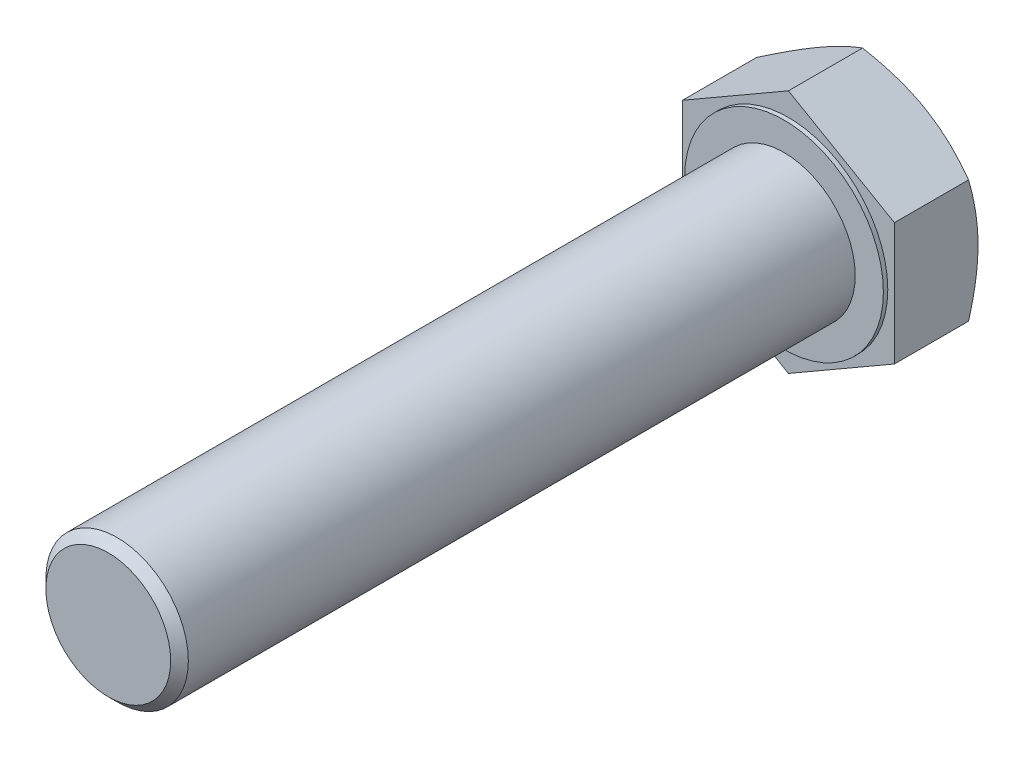
ISO-10303-21;
HEADER;
FILE_DESCRIPTION(('STEP AP214'),'2;1');
FILE_NAME('part.step','',(''),(''),'','','');
FILE_SCHEMA(('AUTOMOTIVE_DESIGN { 1 0 10303 214 1 1 1 1 }'));
ENDSEC;
DATA;
#1=APPLICATION_CONTEXT('core data for automotive mechanical design processes');
#2=APPLICATION_PROTOCOL_DEFINITION('international standard','automotive_design',2000,#1);
#3=PRODUCT_CONTEXT('',#1,'mechanical');
#4=PRODUCT('Part','Part','',(#3));
#5=PRODUCT_RELATED_PRODUCT_CATEGORY('part','',(#4));
#6=PRODUCT_DEFINITION_FORMATION('','',#4);
#7=PRODUCT_DEFINITION_CONTEXT('part definition',#1,'design');
#8=PRODUCT_DEFINITION('design','',#6,#7);
#9=PRODUCT_DEFINITION_SHAPE('','',#8);
#10=(LENGTH_UNIT() NAMED_UNIT(*) SI_UNIT(.MILLI.,.METRE.));
#11=(NAMED_UNIT(*) PLANE_ANGLE_UNIT() SI_UNIT($,.RADIAN.));
#12=(NAMED_UNIT(*) SI_UNIT($,.STERADIAN.) SOLID_ANGLE_UNIT());
#13=UNCERTAINTY_MEASURE_WITH_UNIT(LENGTH_MEASURE(1.E-05),#10,'distance_accuracy_value','');
#14=(GEOMETRIC_REPRESENTATION_CONTEXT(3) GLOBAL_UNCERTAINTY_ASSIGNED_CONTEXT((#13)) GLOBAL_UNIT_ASSIGNED_CONTEXT((#10,
#11,#12)) REPRESENTATION_CONTEXT('',''));
#15=CARTESIAN_POINT('',(0.,0.,0.));
#16=DIRECTION('',(0.,0.,1.));
#17=DIRECTION('',(1.,0.,0.));
#18=AXIS2_PLACEMENT_3D('',#15,#16,#17);
#19=CARTESIAN_POINT('',(12.,6.92820323027551,10.));
#20=DIRECTION('',(-0.5,-0.866025403784439,0.));
#21=DIRECTION('',(0.866025403784439,-0.5,0.));
#22=AXIS2_PLACEMENT_3D('',#19,#20,#21);
#23=PLANE('',#22);
#24=CARTESIAN_POINT('',(-0.00019999999999952,13.8565219306049,1.60973499169925));
#25=CARTESIAN_POINT('',(0.263585795242261,13.7042251307133,1.52182118666063));
#26=CARTESIAN_POINT('',(0.528355119381798,13.5513604901482,1.43789755203143));
#27=CARTESIAN_POINT('',(1.06001701652966,13.244405350712,1.27913777334761));
#28=CARTESIAN_POINT('',(1.32691025729307,13.0903144663124,1.20430461814835));
#29=CARTESIAN_POINT('',(2.13189040597901,12.6255589607763,0.994889094328923));
#30=CARTESIAN_POINT('',(2.6731550738251,12.3130596590925,0.875774791197622));
#31=CARTESIAN_POINT('',(3.48313282915499,11.8454187840152,0.736102615477916));
#32=CARTESIAN_POINT('',(3.74942610048137,11.6916742921315,0.696315351515216));
#33=CARTESIAN_POINT('',(4.28324559869684,11.3834734611381,0.629594923691863));
#34=CARTESIAN_POINT('',(4.55077184921738,11.2290171083848,0.602662007242549));
#35=CARTESIAN_POINT('',(5.08627036632535,10.9198468953819,0.562340146391698));
#36=CARTESIAN_POINT('',(5.35424172206872,10.7651335610083,0.548935107357087));
#37=CARTESIAN_POINT('',(5.89043273227404,10.4555635369292,0.535954648231942));
#38=CARTESIAN_POINT('',(6.15865237880804,10.3007068518009,0.536378800837519));
#39=CARTESIAN_POINT('',(6.6600893787841,10.0112020648831,0.550091573817556));
#40=CARTESIAN_POINT('',(6.89334249317775,9.87653331649856,0.561707537053307));
#41=CARTESIAN_POINT('',(7.35931224173077,9.60750555673725,0.595179563347148));
#42=CARTESIAN_POINT('',(7.59202883677177,9.47314656794544,0.61703635074099));
#43=CARTESIAN_POINT('',(8.05679907604294,9.2048113451909,0.670608971017683));
#44=CARTESIAN_POINT('',(8.288852012362,9.07083551994085,0.702332946967696));
#45=CARTESIAN_POINT('',(8.75186996730498,8.80351197901489,0.775083330145212));
#46=CARTESIAN_POINT('',(8.98283491089354,8.67016430666067,0.816110369657969));
#47=CARTESIAN_POINT('',(9.68394195876366,8.26537996384211,0.954183207756574));
#48=CARTESIAN_POINT('',(10.1520537462785,7.99511549730956,1.06499644281409));
#49=CARTESIAN_POINT('',(11.0812971075914,7.45861659251289,1.31649732141265));
#50=CARTESIAN_POINT('',(11.5424405792922,7.19237528499144,1.45712589713415));
#51=CARTESIAN_POINT('',(12.0002,6.92808776022168,1.60973499169925));
#52=B_SPLINE_CURVE_WITH_KNOTS('',3,(#24,#25,#26,#27,#28,#29,#30,#31,#32,#33,#34,#35,#36,#37,#38,
#39,#40,#41,#42,#43,#44,#45,#46,#47,#48,#49,#50,#51),.UNSPECIFIED.,.F.,.F.,(4,2,2,2,2,2,2,2,2,2,
2,2,2,4),(0.,0.951004872251247,1.90232158356438,3.80900466161368,4.7389455141357,
5.66890426477609,6.59775529889865,7.5265776327693,8.33514643820578,9.14377244252749,
9.95306755799765,10.7624176939264,12.4167102786892,14.0677556316691),.UNSPECIFIED.);
#53=CARTESIAN_POINT('',(0.,13.856406460551,1.60966832419923));
#54=VERTEX_POINT('',#53);
#55=CARTESIAN_POINT('',(12.,6.92820323027552,1.60966832419923));
#56=VERTEX_POINT('',#55);
#57=EDGE_CURVE('E53',#54,#56,#52,.T.);
#58=ORIENTED_EDGE('',*,*,#57,.F.);
#59=DIRECTION('',(0.,0.,-1.));
#60=VECTOR('',#59,1.);
#61=CARTESIAN_POINT('',(0.,13.856406460551,10.));
#62=LINE('',#61,#60);
#63=CARTESIAN_POINT('',(0.,13.856406460551,10.));
#64=VERTEX_POINT('',#63);
#65=EDGE_CURVE('E122',#64,#54,#62,.T.);
#66=ORIENTED_EDGE('',*,*,#65,.F.);
#67=DIRECTION('',(-0.866025403784439,0.5,0.));
#68=VECTOR('',#67,1.);
#69=CARTESIAN_POINT('',(12.,6.92820323027551,10.));
#70=LINE('',#69,#68);
#71=CARTESIAN_POINT('',(12.,6.92820323027551,10.));
#72=VERTEX_POINT('',#71);
#73=EDGE_CURVE('E163',#72,#64,#70,.T.);
#74=ORIENTED_EDGE('',*,*,#73,.F.);
#75=DIRECTION('',(0.,0.,-1.));
#76=VECTOR('',#75,1.);
#77=CARTESIAN_POINT('',(12.,6.92820323027551,10.));
#78=LINE('',#77,#76);
#79=EDGE_CURVE('E110',#72,#56,#78,.T.);
#80=ORIENTED_EDGE('',*,*,#79,.T.);
#81=EDGE_LOOP('',(#58,#66,#74,#80));
#82=FACE_BOUND('',#81,.T.);
#83=ADVANCED_FACE('F38',(#82),#23,.F.);
#84=CARTESIAN_POINT('',(0.,13.856406460551,10.));
#85=DIRECTION('',(0.5,-0.866025403784439,0.));
#86=DIRECTION('',(0.866025403784439,0.5,0.));
#87=AXIS2_PLACEMENT_3D('',#84,#85,#86);
#88=PLANE('',#87);
#89=CARTESIAN_POINT('',(-12.0002,6.92808776022168,1.60973499169925));
#90=CARTESIAN_POINT('',(-11.7364142047577,7.08038456011319,1.52182118666063));
#91=CARTESIAN_POINT('',(-11.4716448806182,7.23324920067831,1.43789755203143));
#92=CARTESIAN_POINT('',(-10.9399829834703,7.5402043401145,1.27913777334761));
#93=CARTESIAN_POINT('',(-10.6730897427069,7.69429522451414,1.20430461814835));
#94=CARTESIAN_POINT('',(-9.86810959402099,8.15905073005028,0.994889094328923));
#95=CARTESIAN_POINT('',(-9.3268449261749,8.47155003173405,0.875774791197622));
#96=CARTESIAN_POINT('',(-8.51686717084501,8.93919090681137,0.736102615477916));
#97=CARTESIAN_POINT('',(-8.25057389951863,9.09293539869504,0.696315351515216));
#98=CARTESIAN_POINT('',(-7.71675440130316,9.40113622968841,0.629594923691863));
#99=CARTESIAN_POINT('',(-7.44922815078262,9.55559258244174,0.602662007242549));
#100=CARTESIAN_POINT('',(-6.91372963367465,9.86476279544467,0.562340146391698));
#101=CARTESIAN_POINT('',(-6.64575827793128,10.0194761298182,0.548935107357088));
#102=CARTESIAN_POINT('',(-6.10956726772596,10.3290461538973,0.535954648231943));
#103=CARTESIAN_POINT('',(-5.84134762119197,10.4839028390257,0.536378800837518));
#104=CARTESIAN_POINT('',(-5.3399106212159,10.7734076259435,0.550091573817556));
#105=CARTESIAN_POINT('',(-5.10665750682225,10.908076374328,0.561707537053307));
#106=CARTESIAN_POINT('',(-4.64068775826924,11.1771041340893,0.59517956334715));
#107=CARTESIAN_POINT('',(-4.40797116322823,11.3114631228811,0.617036350740993));
#108=CARTESIAN_POINT('',(-3.94320092395706,11.5797983456356,0.670608971017685));
#109=CARTESIAN_POINT('',(-3.711147987638,11.7137741708857,0.702332946967698));
#110=CARTESIAN_POINT('',(-3.24813003269502,11.9810977118116,0.775083330145214));
#111=CARTESIAN_POINT('',(-3.01716508910646,12.1144453841659,0.816110369657972));
#112=CARTESIAN_POINT('',(-2.31605804123633,12.5192297269844,0.954183207756577));
#113=CARTESIAN_POINT('',(-1.84794625372147,12.789494193517,1.0649964428141));
#114=CARTESIAN_POINT('',(-0.918702892408578,13.3259930983136,1.31649732141265));
#115=CARTESIAN_POINT('',(-0.457559420707845,13.5922344058351,1.45712589713415));
#116=CARTESIAN_POINT('',(0.000199999999997867,13.8565219306049,1.60973499169925));
#117=B_SPLINE_CURVE_WITH_KNOTS('',3,(#89,#90,#91,#92,#93,#94,#95,#96,#97,#98,#99,#100,#101,#102,
#103,#104,#105,#106,#107,#108,#109,#110,#111,#112,#113,#114,#115,#116),.UNSPECIFIED.,.F.,.F.,(4,
2,2,2,2,2,2,2,2,2,2,2,2,4),(0.,0.951004872251245,1.90232158356438,3.80900466161368,
4.7389455141357,5.66890426477609,6.59775529889865,7.5265776327693,8.33514643820578,
9.14377244252749,9.95306755799765,10.7624176939264,12.4167102786892,14.0677556316691),.UNSPECIFIED.);
#118=CARTESIAN_POINT('',(-12.,6.92820323027551,1.60966832419923));
#119=VERTEX_POINT('',#118);
#120=EDGE_CURVE('E164',#119,#54,#117,.T.);
#121=ORIENTED_EDGE('',*,*,#120,.F.);
#122=DIRECTION('',(0.,0.,-1.));
#123=VECTOR('',#122,1.);
#124=CARTESIAN_POINT('',(-12.,6.92820323027551,10.));
#125=LINE('',#124,#123);
#126=CARTESIAN_POINT('',(-12.,6.92820323027551,10.));
#127=VERTEX_POINT('',#126);
#128=EDGE_CURVE('E119',#127,#119,#125,.T.);
#129=ORIENTED_EDGE('',*,*,#128,.F.);
#130=DIRECTION('',(-0.866025403784439,-0.5,0.));
#131=VECTOR('',#130,1.);
#132=CARTESIAN_POINT('',(0.,13.856406460551,10.));
#133=LINE('',#132,#131);
#134=EDGE_CURVE('E226',#64,#127,#133,.T.);
#135=ORIENTED_EDGE('',*,*,#134,.F.);
#136=ORIENTED_EDGE('',*,*,#65,.T.);
#137=EDGE_LOOP('',(#121,#129,#135,#136));
#138=FACE_BOUND('',#137,.T.);
#139=ADVANCED_FACE('F145',(#138),#88,.F.);
#140=CARTESIAN_POINT('',(-12.,6.92820323027551,10.));
#141=DIRECTION('',(1.,0.,0.));
#142=DIRECTION('',(0.,0.,-1.));
#143=AXIS2_PLACEMENT_3D('',#140,#141,#142);
#144=PLANE('',#143);
#145=CARTESIAN_POINT('',(-12.,-18.5622395178518,6.37102582667648));
#146=CARTESIAN_POINT('',(-12.,-18.3003803929698,6.24406455119856));
#147=CARTESIAN_POINT('',(-12.,-18.0382126831571,6.11774003928089));
#148=CARTESIAN_POINT('',(-12.,-17.5131956762022,5.86650885967292));
#149=CARTESIAN_POINT('',(-12.,-17.2503463721615,5.74160220640276));
#150=CARTESIAN_POINT('',(-12.,-16.4606087734957,5.369192275619));
#151=CARTESIAN_POINT('',(-12.,-15.9326090076651,5.12403705450678));
#152=CARTESIAN_POINT('',(-12.,-14.8701637187487,4.64014973783935));
#153=CARTESIAN_POINT('',(-12.,-14.3356987223154,4.40146029573394));
#154=CARTESIAN_POINT('',(-12.,-13.262501360647,3.93391013278404));
#155=CARTESIAN_POINT('',(-12.,-12.7237691999453,3.70504894418877));
#156=CARTESIAN_POINT('',(-12.,-11.6240116959047,3.25269596667985));
#157=CARTESIAN_POINT('',(-12.,-11.0628209387991,3.02960422316616));
#158=CARTESIAN_POINT('',(-12.,-9.93385235573537,2.60042034846911));
#159=CARTESIAN_POINT('',(-12.,-9.36607379617379,2.39433013167061));
#160=CARTESIAN_POINT('',(-12.,-8.22412305865071,2.00459736039153));
#161=CARTESIAN_POINT('',(-12.,-7.64996665564808,1.82090895759682));
#162=CARTESIAN_POINT('',(-12.,-6.49336377275,1.48189534563762));
#163=CARTESIAN_POINT('',(-12.,-5.91091998179839,1.32656115305126));
#164=CARTESIAN_POINT('',(-12.,-5.0325394312787,1.12089109549254));
#165=CARTESIAN_POINT('',(-12.,-4.73975126819011,1.05702458193855));
#166=CARTESIAN_POINT('',(-12.,-4.15218334683762,0.93916898527813));
#167=CARTESIAN_POINT('',(-12.,-3.85740363024689,0.88517969615097));
#168=CARTESIAN_POINT('',(-12.,-3.26605921980418,0.7880344347601));
#169=CARTESIAN_POINT('',(-12.,-2.96949454809793,0.744878328372926));
#170=CARTESIAN_POINT('',(-12.,-2.37489861794567,0.670262140305099));
#171=CARTESIAN_POINT('',(-12.,-2.07686741619563,0.638801610018248));
#172=CARTESIAN_POINT('',(-12.,-1.48362607672732,0.588593420334001));
#173=CARTESIAN_POINT('',(-12.,-1.18842954035524,0.56968603301083));
#174=CARTESIAN_POINT('',(-12.,-0.597502220693633,0.544368463727201));
#175=CARTESIAN_POINT('',(-12.,-0.301771446283143,0.53795807594489));
#176=CARTESIAN_POINT('',(-12.,0.28969773485913,0.537786786401381));
#177=CARTESIAN_POINT('',(-12.,0.585436141632503,0.544025983519261));
#178=CARTESIAN_POINT('',(-12.,1.17638825973789,0.569002581436694));
#179=CARTESIAN_POINT('',(-12.,1.47160194589474,0.587740566497652));
#180=CARTESIAN_POINT('',(-12.,2.18251168144004,0.647518002912879));
#181=CARTESIAN_POINT('',(-12.,2.5977112358958,0.694566364353147));
#182=CARTESIAN_POINT('',(-12.,3.42500006684955,0.810813022582559));
#183=CARTESIAN_POINT('',(-12.,3.83708890703843,0.880014369563179));
#184=CARTESIAN_POINT('',(-12.,4.65777211624225,1.03810526228645));
#185=CARTESIAN_POINT('',(-12.,5.06636348387438,1.12701024087057));
#186=CARTESIAN_POINT('',(-12.,5.87943373301297,1.32179867585375));
#187=CARTESIAN_POINT('',(-12.,6.28391267958261,1.42768186319236));
#188=CARTESIAN_POINT('',(-12.,7.09769120971281,1.65636678584991));
#189=CARTESIAN_POINT('',(-12.,7.50689957155992,1.77949089984696));
#190=CARTESIAN_POINT('',(-12.,8.32128421768718,2.03835373435357));
#191=CARTESIAN_POINT('',(-12.,8.72646047518976,2.17409253857664));
#192=CARTESIAN_POINT('',(-12.,9.53298375788384,2.45603868787228));
#193=CARTESIAN_POINT('',(-12.,9.93433202651961,2.60224249257521));
#194=CARTESIAN_POINT('',(-12.,10.7337091463723,2.90340894693108));
#195=CARTESIAN_POINT('',(-12.,11.1317380377889,3.05837149033315));
#196=CARTESIAN_POINT('',(-12.,12.0768987673954,3.43641303388305));
#197=CARTESIAN_POINT('',(-12.,12.6226932670203,3.66283072506067));
#198=CARTESIAN_POINT('',(-12.,13.7096160785765,4.12663406656202));
#199=CARTESIAN_POINT('',(-12.,14.2507440942627,4.36402040722046));
#200=CARTESIAN_POINT('',(-12.,15.3292148652383,4.84754192857941));
#201=CARTESIAN_POINT('',(-12.,15.8665567294937,5.09367909138523));
#202=CARTESIAN_POINT('',(-12.,16.9379721720923,5.59291926669502));
#203=CARTESIAN_POINT('',(-12.,17.4720458217244,5.84602212659093));
#204=CARTESIAN_POINT('',(-12.,18.5380633075139,6.35816299358976));
#205=CARTESIAN_POINT('',(-12.,19.0700041290185,6.61720726474219));
#206=CARTESIAN_POINT('',(-12.,20.1315999276427,7.1399373854196));
#207=CARTESIAN_POINT('',(-12.,20.6612548946525,7.40362325544733));
#208=CARTESIAN_POINT('',(-12.,21.7185641607776,7.93479981225136));
#209=CARTESIAN_POINT('',(-12.,22.2462187141147,8.20228999352479));
#210=CARTESIAN_POINT('',(-12.,23.2998881945723,8.74048215919265));
#211=CARTESIAN_POINT('',(-12.,23.8259031153404,9.01118415601106));
#212=CARTESIAN_POINT('',(-12.,25.3127328994437,9.78117795497566));
#213=CARTESIAN_POINT('',(-12.,26.2719079428329,10.283636093319));
#214=CARTESIAN_POINT('',(-12.,28.1867351023259,11.2952882628385));
#215=CARTESIAN_POINT('',(-12.,29.1423870898137,11.8044825368766));
#216=CARTESIAN_POINT('',(-12.,31.0485410270801,12.8267409331922));
#217=CARTESIAN_POINT('',(-12.,31.9990498794206,13.3397921933275));
#218=CARTESIAN_POINT('',(-12.,33.4231550605756,14.1123595628662));
#219=CARTESIAN_POINT('',(-12.,33.8975675704071,14.3703733815282));
#220=CARTESIAN_POINT('',(-12.,34.8459028511762,14.8872978580616));
#221=CARTESIAN_POINT('',(-12.,35.3198256228506,15.1462085145814));
#222=CARTESIAN_POINT('',(-12.,35.7935313914533,15.4055157075192));
#223=B_SPLINE_CURVE_WITH_KNOTS('',3,(#145,#146,#147,#148,#149,#150,#151,#152,#153,#154,#155,
#156,#157,#158,#159,#160,#161,#162,#163,#164,#165,#166,#167,#168,#169,#170,#171,#172,#173,#174,
#175,#176,#177,#178,#179,#180,#181,#182,#183,#184,#185,#186,#187,#188,#189,#190,#191,#192,#193,
#194,#195,#196,#197,#198,#199,#200,#201,#202,#203,#204,#205,#206,#207,#208,#209,#210,#211,#212,
#213,#214,#215,#216,#217,#218,#219,#220,#221,#222),.UNSPECIFIED.,.F.,.F.,(4,2,2,2,2,2,2,2,2,2,2,
2,2,2,2,2,2,2,2,2,2,2,2,2,2,2,2,2,2,2,2,2,2,2,2,2,2,2,4),(0.,0.873041528334548,1.74609192788342,
3.49245362103937,5.24840312490627,7.00426896598962,8.81578295551501,10.6275006452678,
12.4354458667242,14.2428172816026,15.1416962785317,16.0405565243604,16.9394056410316,
17.8382202770671,18.7253671397791,19.6124993913237,20.4996385774165,21.3868192361319,
22.6396951132883,23.8927435701705,25.1467769659896,26.4007904906038,27.6825375104315,
28.9642930367858,30.2456169689066,31.5269253608236,33.2994457606477,35.072077870079,
36.8451140801501,38.6181114765059,40.3930729025591,42.1680421708859,43.9427777513983,
45.7175201992088,48.9659143522556,52.2144259424965,55.4548136932005,57.0749195316846,
58.695022929631),.UNSPECIFIED.);
#224=CARTESIAN_POINT('',(-12.,-6.92820323027551,1.60966832419929));
#225=VERTEX_POINT('',#224);
#226=EDGE_CURVE('E198',#225,#119,#223,.T.);
#227=ORIENTED_EDGE('',*,*,#226,.F.);
#228=DIRECTION('',(0.,0.,-1.));
#229=VECTOR('',#228,1.);
#230=CARTESIAN_POINT('',(-12.,-6.92820323027551,10.));
#231=LINE('',#230,#229);
#232=CARTESIAN_POINT('',(-12.,-6.92820323027551,10.));
#233=VERTEX_POINT('',#232);
#234=EDGE_CURVE('E112',#233,#225,#231,.T.);
#235=ORIENTED_EDGE('',*,*,#234,.F.);
#236=DIRECTION('',(0.,-1.,0.));
#237=VECTOR('',#236,1.);
#238=CARTESIAN_POINT('',(-12.,6.92820323027551,10.));
#239=LINE('',#238,#237);
#240=EDGE_CURVE('E230',#127,#233,#239,.T.);
#241=ORIENTED_EDGE('',*,*,#240,.F.);
#242=ORIENTED_EDGE('',*,*,#128,.T.);
#243=EDGE_LOOP('',(#227,#235,#241,#242));
#244=FACE_BOUND('',#243,.T.);
#245=ADVANCED_FACE('F150',(#244),#144,.F.);
#246=CARTESIAN_POINT('',(-12.,-6.92820323027551,10.));
#247=DIRECTION('',(0.5,0.866025403784439,0.));
#248=DIRECTION('',(-0.866025403784439,0.5,0.));
#249=AXIS2_PLACEMENT_3D('',#246,#247,#248);
#250=PLANE('',#249);
#251=CARTESIAN_POINT('',(0.000199999999997686,-13.8565219306049,1.60973499169925));
#252=CARTESIAN_POINT('',(-0.263585795242263,-13.7042251307133,1.52182118666063));
#253=CARTESIAN_POINT('',(-0.528355119381801,-13.5513604901482,1.43789755203143));
#254=CARTESIAN_POINT('',(-1.06001701652966,-13.244405350712,1.27913777334761));
#255=CARTESIAN_POINT('',(-1.32691025729307,-13.0903144663124,1.20430461814835));
#256=CARTESIAN_POINT('',(-2.13189040597901,-12.6255589607763,0.994889094328921));
#257=CARTESIAN_POINT('',(-2.6731550738251,-12.3130596590925,0.87577479119762));
#258=CARTESIAN_POINT('',(-3.483132829155,-11.8454187840152,0.736102615477914));
#259=CARTESIAN_POINT('',(-3.74942610048137,-11.6916742921315,0.696315351515214));
#260=CARTESIAN_POINT('',(-4.28324559869684,-11.3834734611381,0.629594923691861));
#261=CARTESIAN_POINT('',(-4.55077184921738,-11.2290171083848,0.602662007242547));
#262=CARTESIAN_POINT('',(-5.08627036632535,-10.9198468953819,0.562340146391696));
#263=CARTESIAN_POINT('',(-5.35424172206873,-10.7651335610083,0.548935107357086));
#264=CARTESIAN_POINT('',(-5.89043273227404,-10.4555635369292,0.535954648231943));
#265=CARTESIAN_POINT('',(-6.15865237880804,-10.3007068518009,0.536378800837519));
#266=CARTESIAN_POINT('',(-6.66008937878411,-10.011202064883,0.550091573817556));
#267=CARTESIAN_POINT('',(-6.89334249317776,-9.87653331649855,0.561707537053305));
#268=CARTESIAN_POINT('',(-7.35931224173077,-9.60750555673725,0.595179563347147));
#269=CARTESIAN_POINT('',(-7.59202883677177,-9.47314656794543,0.617036350740991));
#270=CARTESIAN_POINT('',(-8.05679907604295,-9.20481134519089,0.670608971017683));
#271=CARTESIAN_POINT('',(-8.28885201236201,-9.07083551994084,0.702332946967696));
#272=CARTESIAN_POINT('',(-8.75186996730499,-8.80351197901489,0.775083330145212));
#273=CARTESIAN_POINT('',(-8.98283491089354,-8.67016430666066,0.81611036965797));
#274=CARTESIAN_POINT('',(-9.68394195876367,-8.2653799638421,0.954183207756576));
#275=CARTESIAN_POINT('',(-10.1520537462785,-7.99511549730956,1.0649964428141));
#276=CARTESIAN_POINT('',(-11.0812971075914,-7.45861659251289,1.31649732141265));
#277=CARTESIAN_POINT('',(-11.5424405792922,-7.19237528499143,1.45712589713415));
#278=CARTESIAN_POINT('',(-12.0002,-6.92808776022167,1.60973499169925));
#279=B_SPLINE_CURVE_WITH_KNOTS('',3,(#251,#252,#253,#254,#255,#256,#257,#258,#259,#260,#261,
#262,#263,#264,#265,#266,#267,#268,#269,#270,#271,#272,#273,#274,#275,#276,#277,#278),
.UNSPECIFIED.,.F.,.F.,(4,2,2,2,2,2,2,2,2,2,2,2,2,4),(0.,0.951004872251246,1.90232158356438,
3.80900466161368,4.7389455141357,5.66890426477609,6.59775529889865,7.5265776327693,
8.33514643820579,9.14377244252749,9.95306755799766,10.7624176939264,12.4167102786892,
14.0677556316691),.UNSPECIFIED.);
#280=CARTESIAN_POINT('',(0.,-13.856406460551,1.60966832419929));
#281=VERTEX_POINT('',#280);
#282=EDGE_CURVE('E107',#281,#225,#279,.T.);
#283=ORIENTED_EDGE('',*,*,#282,.F.);
#284=DIRECTION('',(0.,0.,-1.));
#285=VECTOR('',#284,1.);
#286=CARTESIAN_POINT('',(0.,-13.856406460551,10.));
#287=LINE('',#286,#285);
#288=CARTESIAN_POINT('',(0.,-13.856406460551,10.));
#289=VERTEX_POINT('',#288);
#290=EDGE_CURVE('E106',#289,#281,#287,.T.);
#291=ORIENTED_EDGE('',*,*,#290,.F.);
#292=DIRECTION('',(0.866025403784438,-0.5,0.));
#293=VECTOR('',#292,1.);
#294=CARTESIAN_POINT('',(-12.,-6.92820323027551,10.));
#295=LINE('',#294,#293);
#296=EDGE_CURVE('E231',#233,#289,#295,.T.);
#297=ORIENTED_EDGE('',*,*,#296,.F.);
#298=ORIENTED_EDGE('',*,*,#234,.T.);
#299=EDGE_LOOP('',(#283,#291,#297,#298));
#300=FACE_BOUND('',#299,.T.);
#301=ADVANCED_FACE('F204',(#300),#250,.F.);
#302=CARTESIAN_POINT('',(0.,-13.856406460551,10.));
#303=DIRECTION('',(-0.5,0.866025403784439,0.));
#304=DIRECTION('',(-0.866025403784439,-0.5,0.));
#305=AXIS2_PLACEMENT_3D('',#302,#303,#304);
#306=PLANE('',#305);
#307=CARTESIAN_POINT('',(12.0002,-6.92808776022167,1.60973499169925));
#308=CARTESIAN_POINT('',(11.7364142047577,-7.08038456011319,1.52182118666063));
#309=CARTESIAN_POINT('',(11.4716448806182,-7.23324920067831,1.43789755203143));
#310=CARTESIAN_POINT('',(10.9399829834703,-7.5402043401145,1.2791377733476));
#311=CARTESIAN_POINT('',(10.6730897427069,-7.69429522451414,1.20430461814835));
#312=CARTESIAN_POINT('',(9.86810959402099,-8.15905073005027,0.99488909432892));
#313=CARTESIAN_POINT('',(9.3268449261749,-8.47155003173405,0.875774791197619));
#314=CARTESIAN_POINT('',(8.516867170845,-8.93919090681137,0.736102615477914));
#315=CARTESIAN_POINT('',(8.25057389951863,-9.09293539869504,0.696315351515214));
#316=CARTESIAN_POINT('',(7.71675440130316,-9.40113622968841,0.629594923691862));
#317=CARTESIAN_POINT('',(7.44922815078262,-9.55559258244173,0.602662007242547));
#318=CARTESIAN_POINT('',(6.91372963367465,-9.86476279544467,0.562340146391695));
#319=CARTESIAN_POINT('',(6.64575827793127,-10.0194761298182,0.548935107357085));
#320=CARTESIAN_POINT('',(6.10956726772596,-10.3290461538973,0.535954648231941));
#321=CARTESIAN_POINT('',(5.84134762119196,-10.4839028390257,0.536378800837519));
#322=CARTESIAN_POINT('',(5.33991062121589,-10.7734076259435,0.550091573817556));
#323=CARTESIAN_POINT('',(5.10665750682224,-10.908076374328,0.561707537053306));
#324=CARTESIAN_POINT('',(4.64068775826923,-11.1771041340893,0.595179563347147));
#325=CARTESIAN_POINT('',(4.40797116322823,-11.3114631228811,0.61703635074099));
#326=CARTESIAN_POINT('',(3.94320092395705,-11.5797983456356,0.670608971017682));
#327=CARTESIAN_POINT('',(3.71114798763799,-11.7137741708857,0.702332946967695));
#328=CARTESIAN_POINT('',(3.24813003269502,-11.9810977118116,0.775083330145211));
#329=CARTESIAN_POINT('',(3.01716508910646,-12.1144453841659,0.816110369657968));
#330=CARTESIAN_POINT('',(2.31605804123633,-12.5192297269844,0.954183207756574));
#331=CARTESIAN_POINT('',(1.84794625372147,-12.789494193517,1.06499644281409));
#332=CARTESIAN_POINT('',(0.918702892408573,-13.3259930983136,1.31649732141265));
#333=CARTESIAN_POINT('',(0.45755942070784,-13.5922344058351,1.45712589713415));
#334=CARTESIAN_POINT('',(-0.000200000000002704,-13.8565219306049,1.60973499169925));
#335=B_SPLINE_CURVE_WITH_KNOTS('',3,(#307,#308,#309,#310,#311,#312,#313,#314,#315,#316,#317,
#318,#319,#320,#321,#322,#323,#324,#325,#326,#327,#328,#329,#330,#331,#332,#333,#334),
.UNSPECIFIED.,.F.,.F.,(4,2,2,2,2,2,2,2,2,2,2,2,2,4),(0.,0.951004872251246,1.90232158356438,
3.80900466161368,4.7389455141357,5.66890426477609,6.59775529889865,7.5265776327693,
8.33514643820578,9.14377244252749,9.95306755799765,10.7624176939264,12.4167102786892,
14.0677556316691),.UNSPECIFIED.);
#336=CARTESIAN_POINT('',(12.,-6.92820323027551,1.60966832419929));
#337=VERTEX_POINT('',#336);
#338=EDGE_CURVE('E92',#337,#281,#335,.T.);
#339=ORIENTED_EDGE('',*,*,#338,.F.);
#340=DIRECTION('',(0.,0.,-1.));
#341=VECTOR('',#340,1.);
#342=CARTESIAN_POINT('',(12.,-6.92820323027551,10.));
#343=LINE('',#342,#341);
#344=CARTESIAN_POINT('',(12.,-6.92820323027551,10.));
#345=VERTEX_POINT('',#344);
#346=EDGE_CURVE('E104',#345,#337,#343,.T.);
#347=ORIENTED_EDGE('',*,*,#346,.F.);
#348=DIRECTION('',(0.866025403784439,0.5,0.));
#349=VECTOR('',#348,1.);
#350=CARTESIAN_POINT('',(0.,-13.856406460551,10.));
#351=LINE('',#350,#349);
#352=EDGE_CURVE('E235',#289,#345,#351,.T.);
#353=ORIENTED_EDGE('',*,*,#352,.F.);
#354=ORIENTED_EDGE('',*,*,#290,.T.);
#355=EDGE_LOOP('',(#339,#347,#353,#354));
#356=FACE_BOUND('',#355,.T.);
#357=ADVANCED_FACE('F102',(#356),#306,.F.);
#358=CARTESIAN_POINT('',(12.,-6.92820323027551,10.));
#359=DIRECTION('',(-1.,0.,0.));
#360=DIRECTION('',(0.,0.,1.));
#361=AXIS2_PLACEMENT_3D('',#358,#359,#360);
#362=PLANE('',#361);
#363=CARTESIAN_POINT('',(12.,-18.5622395178519,6.37102582667648));
#364=CARTESIAN_POINT('',(12.,-18.3003803929698,6.24406455119856));
#365=CARTESIAN_POINT('',(12.,-18.0382126831571,6.11774003928089));
#366=CARTESIAN_POINT('',(12.,-17.5131956762022,5.86650885967292));
#367=CARTESIAN_POINT('',(12.,-17.2503463721615,5.74160220640276));
#368=CARTESIAN_POINT('',(12.,-16.4606087734957,5.369192275619));
#369=CARTESIAN_POINT('',(12.,-15.9326090076651,5.12403705450678));
#370=CARTESIAN_POINT('',(12.,-14.8701637187487,4.64014973783935));
#371=CARTESIAN_POINT('',(12.,-14.3356987223154,4.40146029573394));
#372=CARTESIAN_POINT('',(12.,-13.262501360647,3.93391013278404));
#373=CARTESIAN_POINT('',(12.,-12.7237691999453,3.70504894418877));
#374=CARTESIAN_POINT('',(12.,-11.6240116959047,3.25269596667985));
#375=CARTESIAN_POINT('',(12.,-11.0628209387991,3.02960422316616));
#376=CARTESIAN_POINT('',(12.,-9.93385235573538,2.60042034846912));
#377=CARTESIAN_POINT('',(12.,-9.3660737961738,2.39433013167061));
#378=CARTESIAN_POINT('',(12.,-8.22412305865072,2.00459736039153));
#379=CARTESIAN_POINT('',(12.,-7.64996665564809,1.82090895759682));
#380=CARTESIAN_POINT('',(12.,-6.49336377275001,1.48189534563762));
#381=CARTESIAN_POINT('',(12.,-5.9109199817984,1.32656115305126));
#382=CARTESIAN_POINT('',(12.,-5.03253943127871,1.12089109549254));
#383=CARTESIAN_POINT('',(12.,-4.73975126819012,1.05702458193855));
#384=CARTESIAN_POINT('',(12.,-4.15218334683763,0.939168985278128));
#385=CARTESIAN_POINT('',(12.,-3.8574036302469,0.885179696150969));
#386=CARTESIAN_POINT('',(12.,-3.26605921980419,0.788034434760098));
#387=CARTESIAN_POINT('',(12.,-2.96949454809793,0.744878328372924));
#388=CARTESIAN_POINT('',(12.,-2.37489861794568,0.670262140305097));
#389=CARTESIAN_POINT('',(12.,-2.07686741619563,0.638801610018245));
#390=CARTESIAN_POINT('',(12.,-1.48362607672732,0.588593420333998));
#391=CARTESIAN_POINT('',(12.,-1.18842954035525,0.569686033010826));
#392=CARTESIAN_POINT('',(12.,-0.59750222069364,0.544368463727197));
#393=CARTESIAN_POINT('',(12.,-0.301771446283149,0.537958075944887));
#394=CARTESIAN_POINT('',(12.,0.289697734859126,0.537786786401378));
#395=CARTESIAN_POINT('',(12.,0.585436141632499,0.544025983519257));
#396=CARTESIAN_POINT('',(12.,1.17638825973788,0.569002581436691));
#397=CARTESIAN_POINT('',(12.,1.47160194589473,0.587740566497652));
#398=CARTESIAN_POINT('',(12.,2.18251168144004,0.64751800291288));
#399=CARTESIAN_POINT('',(12.,2.59771123589579,0.694566364353144));
#400=CARTESIAN_POINT('',(12.,3.42500006684954,0.810813022582553));
#401=CARTESIAN_POINT('',(12.,3.83708890703842,0.880014369563173));
#402=CARTESIAN_POINT('',(12.,4.65777211624224,1.03810526228645));
#403=CARTESIAN_POINT('',(12.,5.06636348387437,1.12701024087056));
#404=CARTESIAN_POINT('',(12.,5.87943373301296,1.32179867585374));
#405=CARTESIAN_POINT('',(12.,6.2839126795826,1.42768186319235));
#406=CARTESIAN_POINT('',(12.,7.0976912097128,1.6563667858499));
#407=CARTESIAN_POINT('',(12.,7.5068995715599,1.77949089984695));
#408=CARTESIAN_POINT('',(12.,8.32128421768716,2.03835373435356));
#409=CARTESIAN_POINT('',(12.,8.72646047518975,2.17409253857663));
#410=CARTESIAN_POINT('',(12.,9.53298375788382,2.45603868787227));
#411=CARTESIAN_POINT('',(12.,9.93433202651959,2.60224249257519));
#412=CARTESIAN_POINT('',(12.,10.7337091463723,2.90340894693107));
#413=CARTESIAN_POINT('',(12.,11.1317380377889,3.05837149033315));
#414=CARTESIAN_POINT('',(12.,12.0768987673954,3.43641303388305));
#415=CARTESIAN_POINT('',(12.,12.6226932670203,3.66283072506066));
#416=CARTESIAN_POINT('',(12.,13.7096160785765,4.126634066562));
#417=CARTESIAN_POINT('',(12.,14.2507440942626,4.36402040722045));
#418=CARTESIAN_POINT('',(12.,15.3292148652383,4.8475419285794));
#419=CARTESIAN_POINT('',(12.,15.8665567294937,5.09367909138521));
#420=CARTESIAN_POINT('',(12.,16.9379721720923,5.59291926669501));
#421=CARTESIAN_POINT('',(12.,17.4720458217244,5.84602212659092));
#422=CARTESIAN_POINT('',(12.,18.5380633075139,6.35816299358976));
#423=CARTESIAN_POINT('',(12.,19.0700041290185,6.61720726474218));
#424=CARTESIAN_POINT('',(12.,20.1315999276427,7.1399373854196));
#425=CARTESIAN_POINT('',(12.,20.6612548946525,7.40362325544732));
#426=CARTESIAN_POINT('',(12.,21.7185641607776,7.93479981225135));
#427=CARTESIAN_POINT('',(12.,22.2462187141147,8.20228999352478));
#428=CARTESIAN_POINT('',(12.,23.2998881945723,8.74048215919264));
#429=CARTESIAN_POINT('',(12.,23.8259031153404,9.01118415601106));
#430=CARTESIAN_POINT('',(12.,25.3127328994437,9.78117795497566));
#431=CARTESIAN_POINT('',(12.,26.2719079428329,10.283636093319));
#432=CARTESIAN_POINT('',(12.,28.1867351023259,11.2952882628385));
#433=CARTESIAN_POINT('',(12.,29.1423870898137,11.8044825368766));
#434=CARTESIAN_POINT('',(12.,31.0485410270801,12.8267409331922));
#435=CARTESIAN_POINT('',(12.,31.9990498794206,13.3397921933275));
#436=CARTESIAN_POINT('',(12.,33.4231550605756,14.1123595628662));
#437=CARTESIAN_POINT('',(12.,33.8975675704071,14.3703733815282));
#438=CARTESIAN_POINT('',(12.,34.8459028511762,14.8872978580615));
#439=CARTESIAN_POINT('',(12.,35.3198256228506,15.1462085145814));
#440=CARTESIAN_POINT('',(12.,35.7935313914533,15.4055157075192));
#441=B_SPLINE_CURVE_WITH_KNOTS('',3,(#363,#364,#365,#366,#367,#368,#369,#370,#371,#372,#373,
#374,#375,#376,#377,#378,#379,#380,#381,#382,#383,#384,#385,#386,#387,#388,#389,#390,#391,#392,
#393,#394,#395,#396,#397,#398,#399,#400,#401,#402,#403,#404,#405,#406,#407,#408,#409,#410,#411,
#412,#413,#414,#415,#416,#417,#418,#419,#420,#421,#422,#423,#424,#425,#426,#427,#428,#429,#430,
#431,#432,#433,#434,#435,#436,#437,#438,#439,#440),.UNSPECIFIED.,.F.,.F.,(4,2,2,2,2,2,2,2,2,2,2,
2,2,2,2,2,2,2,2,2,2,2,2,2,2,2,2,2,2,2,2,2,2,2,2,2,2,2,4),(0.,0.873041528334551,1.74609192788342,
3.49245362103936,5.24840312490627,7.00426896598961,8.815782955515,10.6275006452678,
12.4354458667242,14.2428172816026,15.1416962785317,16.0405565243604,16.9394056410316,
17.838220277067,18.7253671397791,19.6124993913237,20.4996385774165,21.3868192361319,
22.6396951132883,23.8927435701705,25.1467769659896,26.4007904906038,27.6825375104314,
28.9642930367858,30.2456169689066,31.5269253608236,33.2994457606477,35.072077870079,
36.84511408015,38.6181114765059,40.3930729025591,42.1680421708859,43.9427777513983,
45.7175201992088,48.9659143522556,52.2144259424965,55.4548136932005,57.0749195316846,
58.695022929631),.UNSPECIFIED.);
#442=EDGE_CURVE('E89',#56,#337,#441,.F.);
#443=ORIENTED_EDGE('',*,*,#442,.F.);
#444=ORIENTED_EDGE('',*,*,#79,.F.);
#445=DIRECTION('',(0.,1.,0.));
#446=VECTOR('',#445,1.);
#447=CARTESIAN_POINT('',(12.,-6.92820323027551,10.));
#448=LINE('',#447,#446);
#449=EDGE_CURVE('E61',#345,#72,#448,.T.);
#450=ORIENTED_EDGE('',*,*,#449,.F.);
#451=ORIENTED_EDGE('',*,*,#346,.T.);
#452=EDGE_LOOP('',(#443,#444,#450,#451));
#453=FACE_BOUND('',#452,.T.);
#454=ADVANCED_FACE('F109',(#453),#362,.F.);
#455=CARTESIAN_POINT('',(0.,0.,10.));
#456=DIRECTION('',(0.,0.,1.));
#457=DIRECTION('',(1.,0.,0.));
#458=AXIS2_PLACEMENT_3D('',#455,#456,#457);
#459=PLANE('',#458);
#460=CARTESIAN_POINT('',(0.,0.,10.));
#461=DIRECTION('',(0.,0.,1.));
#462=DIRECTION('',(1.,0.,0.));
#463=AXIS2_PLACEMENT_3D('',#460,#461,#462);
#464=CIRCLE('',#463,11.25);
#465=CARTESIAN_POINT('',(11.25,0.,10.));
#466=VERTEX_POINT('',#465);
#467=EDGE_CURVE('E223',#466,#466,#464,.T.);
#468=ORIENTED_EDGE('',*,*,#467,.F.);
#469=EDGE_LOOP('',(#468));
#470=FACE_BOUND('',#469,.T.);
#471=ORIENTED_EDGE('',*,*,#73,.T.);
#472=ORIENTED_EDGE('',*,*,#134,.T.);
#473=ORIENTED_EDGE('',*,*,#240,.T.);
#474=ORIENTED_EDGE('',*,*,#296,.T.);
#475=ORIENTED_EDGE('',*,*,#352,.T.);
#476=ORIENTED_EDGE('',*,*,#449,.T.);
#477=EDGE_LOOP('',(#471,#472,#473,#474,#475,#476));
#478=FACE_BOUND('',#477,.T.);
#479=ADVANCED_FACE('F175',(#470,#478),#459,.T.);
#480=CARTESIAN_POINT('',(0.,0.,3.49549265003463));
#481=DIRECTION('',(0.,0.,1.));
#482=DIRECTION('',(1.,0.,0.));
#483=AXIS2_PLACEMENT_3D('',#480,#481,#482);
#484=CONICAL_SURFACE('',#483,17.1227500070473,1.0471975511966);
#485=CARTESIAN_POINT('',(0.,0.,0.));
#486=DIRECTION('',(0.,0.,1.));
#487=DIRECTION('',(1.,0.,0.));
#488=AXIS2_PLACEMENT_3D('',#485,#486,#487);
#489=CIRCLE('',#488,11.0683791397036);
#490=CARTESIAN_POINT('',(11.0683791397036,0.,0.));
#491=VERTEX_POINT('',#490);
#492=EDGE_CURVE('E97',#491,#491,#489,.T.);
#493=ORIENTED_EDGE('',*,*,#492,.T.);
#494=EDGE_LOOP('',(#493));
#495=FACE_BOUND('',#494,.T.);
#496=ORIENTED_EDGE('',*,*,#57,.T.);
#497=ORIENTED_EDGE('',*,*,#442,.T.);
#498=ORIENTED_EDGE('',*,*,#338,.T.);
#499=ORIENTED_EDGE('',*,*,#282,.T.);
#500=ORIENTED_EDGE('',*,*,#226,.T.);
#501=ORIENTED_EDGE('',*,*,#120,.T.);
#502=EDGE_LOOP('',(#496,#497,#498,#499,#500,#501));
#503=FACE_BOUND('',#502,.T.);
#504=ADVANCED_FACE('F91',(#495,#503),#484,.T.);
#505=CARTESIAN_POINT('',(0.,0.,0.));
#506=DIRECTION('',(0.,0.,1.));
#507=DIRECTION('',(1.,0.,0.));
#508=AXIS2_PLACEMENT_3D('',#505,#506,#507);
#509=PLANE('',#508);
#510=ORIENTED_EDGE('',*,*,#492,.F.);
#511=EDGE_LOOP('',(#510));
#512=FACE_BOUND('',#511,.T.);
#513=ADVANCED_FACE('F174',(#512),#509,.F.);
#514=CARTESIAN_POINT('',(0.,0.,10.5));
#515=DIRECTION('',(0.,0.,-1.));
#516=DIRECTION('',(-1.,0.,0.));
#517=AXIS2_PLACEMENT_3D('',#514,#515,#516);
#518=CYLINDRICAL_SURFACE('',#517,11.25);
#519=CARTESIAN_POINT('',(0.,0.,10.5));
#520=DIRECTION('',(0.,0.,1.));
#521=DIRECTION('',(1.,0.,0.));
#522=AXIS2_PLACEMENT_3D('',#519,#520,#521);
#523=CIRCLE('',#522,11.25);
#524=CARTESIAN_POINT('',(11.25,0.,10.5));
#525=VERTEX_POINT('',#524);
#526=EDGE_CURVE('E129',#525,#525,#523,.T.);
#527=ORIENTED_EDGE('',*,*,#526,.F.);
#528=EDGE_LOOP('',(#527));
#529=FACE_BOUND('',#528,.T.);
#530=ORIENTED_EDGE('',*,*,#467,.T.);
#531=EDGE_LOOP('',(#530));
#532=FACE_BOUND('',#531,.T.);
#533=ADVANCED_FACE('F177',(#529,#532),#518,.T.);
#534=CARTESIAN_POINT('',(0.,0.,10.5));
#535=DIRECTION('',(0.,0.,1.));
#536=DIRECTION('',(1.,0.,0.));
#537=AXIS2_PLACEMENT_3D('',#534,#535,#536);
#538=PLANE('',#537);
#539=CARTESIAN_POINT('',(0.,0.,10.5));
#540=DIRECTION('',(0.,0.,1.));
#541=DIRECTION('',(1.,0.,0.));
#542=AXIS2_PLACEMENT_3D('',#539,#540,#541);
#543=CIRCLE('',#542,8.0635);
#544=CARTESIAN_POINT('',(8.0635,0.,10.5));
#545=VERTEX_POINT('',#544);
#546=EDGE_CURVE('E127',#545,#545,#543,.T.);
#547=ORIENTED_EDGE('',*,*,#546,.F.);
#548=EDGE_LOOP('',(#547));
#549=FACE_BOUND('',#548,.T.);
#550=ORIENTED_EDGE('',*,*,#526,.T.);
#551=EDGE_LOOP('',(#550));
#552=FACE_BOUND('',#551,.T.);
#553=ADVANCED_FACE('F244',(#549,#552),#538,.T.);
#554=CARTESIAN_POINT('',(0.,0.,87.));
#555=DIRECTION('',(0.,0.,1.));
#556=DIRECTION('',(1.,0.,0.));
#557=AXIS2_PLACEMENT_3D('',#554,#555,#556);
#558=PLANE('',#557);
#559=CARTESIAN_POINT('',(0.,0.,87.));
#560=DIRECTION('',(0.,0.,1.));
#561=DIRECTION('',(1.,0.,0.));
#562=AXIS2_PLACEMENT_3D('',#559,#560,#561);
#563=CIRCLE('',#562,7.06350000000003);
#564=CARTESIAN_POINT('',(7.06350000000003,0.,87.));
#565=VERTEX_POINT('',#564);
#566=EDGE_CURVE('E46',#565,#565,#563,.T.);
#567=ORIENTED_EDGE('',*,*,#566,.T.);
#568=EDGE_LOOP('',(#567));
#569=FACE_BOUND('',#568,.T.);
#570=ADVANCED_FACE('F133',(#569),#558,.T.);
#571=CARTESIAN_POINT('',(0.,0.,87.));
#572=DIRECTION('',(0.,0.,-1.));
#573=DIRECTION('',(-1.,0.,0.));
#574=AXIS2_PLACEMENT_3D('',#571,#572,#573);
#575=CYLINDRICAL_SURFACE('',#574,8.0635);
#576=CARTESIAN_POINT('',(0.,0.,86.));
#577=DIRECTION('',(0.,0.,1.));
#578=DIRECTION('',(1.,0.,0.));
#579=AXIS2_PLACEMENT_3D('',#576,#577,#578);
#580=CIRCLE('',#579,8.0635);
#581=CARTESIAN_POINT('',(8.0635,0.,86.));
#582=VERTEX_POINT('',#581);
#583=EDGE_CURVE('E11',#582,#582,#580,.F.);
#584=ORIENTED_EDGE('',*,*,#583,.T.);
#585=EDGE_LOOP('',(#584));
#586=FACE_BOUND('',#585,.T.);
#587=ORIENTED_EDGE('',*,*,#546,.T.);
#588=EDGE_LOOP('',(#587));
#589=FACE_BOUND('',#588,.T.);
#590=ADVANCED_FACE('F136',(#586,#589),#575,.T.);
#591=CARTESIAN_POINT('',(0.,0.,87.));
#592=DIRECTION('',(0.,0.,-1.));
#593=DIRECTION('',(-1.,0.,0.));
#594=AXIS2_PLACEMENT_3D('',#591,#592,#593);
#595=CONICAL_SURFACE('',#594,7.06350000000003,0.785398163397441);
#596=ORIENTED_EDGE('',*,*,#583,.F.);
#597=EDGE_LOOP('',(#596));
#598=FACE_BOUND('',#597,.T.);
#599=ORIENTED_EDGE('',*,*,#566,.F.);
#600=EDGE_LOOP('',(#599));
#601=FACE_BOUND('',#600,.T.);
#602=ADVANCED_FACE('F40',(#598,#601),#595,.T.);
#603=CLOSED_SHELL('',(#83,#139,#245,#301,#357,#454,#479,#504,#513,#533,#553,#570,#590,#602));
#604=MANIFOLD_SOLID_BREP('B2',#603);
#605=ADVANCED_BREP_SHAPE_REPRESENTATION('',(#18,#604),#14);
#606=SHAPE_DEFINITION_REPRESENTATION(#9,#605);
ENDSEC;
END-ISO-10303-21;
